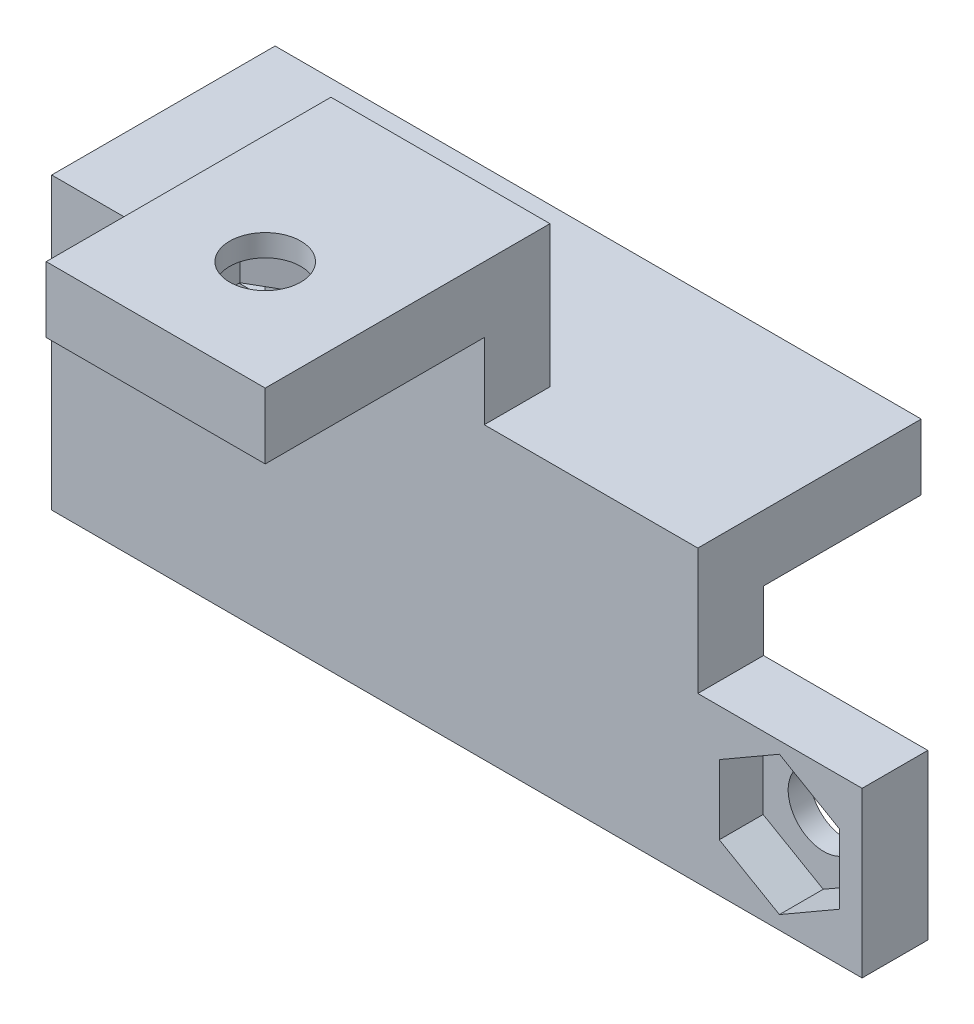
ISO-10303-21;
HEADER;
FILE_DESCRIPTION(('STEP AP214'),'2;1');
FILE_NAME('part.step','',(''),(''),'','','');
FILE_SCHEMA(('AUTOMOTIVE_DESIGN { 1 0 10303 214 1 1 1 1 }'));
ENDSEC;
DATA;
#1=APPLICATION_CONTEXT('core data for automotive mechanical design processes');
#2=APPLICATION_PROTOCOL_DEFINITION('international standard','automotive_design',2000,#1);
#3=PRODUCT_CONTEXT('',#1,'mechanical');
#4=PRODUCT('Part','Part','',(#3));
#5=PRODUCT_RELATED_PRODUCT_CATEGORY('part','',(#4));
#6=PRODUCT_DEFINITION_FORMATION('','',#4);
#7=PRODUCT_DEFINITION_CONTEXT('part definition',#1,'design');
#8=PRODUCT_DEFINITION('design','',#6,#7);
#9=PRODUCT_DEFINITION_SHAPE('','',#8);
#10=(LENGTH_UNIT() NAMED_UNIT(*) SI_UNIT(.MILLI.,.METRE.));
#11=(NAMED_UNIT(*) PLANE_ANGLE_UNIT() SI_UNIT($,.RADIAN.));
#12=(NAMED_UNIT(*) SI_UNIT($,.STERADIAN.) SOLID_ANGLE_UNIT());
#13=UNCERTAINTY_MEASURE_WITH_UNIT(LENGTH_MEASURE(1.E-05),#10,'distance_accuracy_value','');
#14=(GEOMETRIC_REPRESENTATION_CONTEXT(3) GLOBAL_UNCERTAINTY_ASSIGNED_CONTEXT((#13)) GLOBAL_UNIT_ASSIGNED_CONTEXT((#10,
#11,#12)) REPRESENTATION_CONTEXT('',''));
#15=CARTESIAN_POINT('',(0.,0.,0.));
#16=DIRECTION('',(0.,0.,1.));
#17=DIRECTION('',(1.,0.,0.));
#18=AXIS2_PLACEMENT_3D('',#15,#16,#17);
#19=CARTESIAN_POINT('',(-62.7088413646962,-5.00000000000036,8.));
#20=DIRECTION('',(0.,-1.,0.));
#21=DIRECTION('',(0.,0.,-1.));
#22=AXIS2_PLACEMENT_3D('',#19,#20,#21);
#23=CYLINDRICAL_SURFACE('',#22,1.625);
#24=CARTESIAN_POINT('',(-62.7088413646962,-5.00000000000036,8.));
#25=DIRECTION('',(0.,-1.,0.));
#26=DIRECTION('',(0.,0.,-1.));
#27=AXIS2_PLACEMENT_3D('',#24,#25,#26);
#28=CIRCLE('',#27,1.625);
#29=CARTESIAN_POINT('',(-62.7088413646962,-5.00000000000036,6.375));
#30=VERTEX_POINT('',#29);
#31=EDGE_CURVE('E475',#30,#30,#28,.T.);
#32=ORIENTED_EDGE('',*,*,#31,.F.);
#33=EDGE_LOOP('',(#32));
#34=FACE_BOUND('',#33,.T.);
#35=CARTESIAN_POINT('',(-62.7088413646962,-6.00000000000036,8.));
#36=DIRECTION('',(0.,-1.,0.));
#37=DIRECTION('',(0.,0.,-1.));
#38=AXIS2_PLACEMENT_3D('',#35,#36,#37);
#39=CIRCLE('',#38,1.625);
#40=CARTESIAN_POINT('',(-62.7088413646962,-6.00000000000036,6.375));
#41=VERTEX_POINT('',#40);
#42=EDGE_CURVE('E36',#41,#41,#39,.F.);
#43=ORIENTED_EDGE('',*,*,#42,.F.);
#44=EDGE_LOOP('',(#43));
#45=FACE_BOUND('',#44,.T.);
#46=ADVANCED_FACE('F32',(#34,#45),#23,.F.);
#47=CARTESIAN_POINT('',(0.,0.,3.));
#48=DIRECTION('',(0.,0.,1.));
#49=DIRECTION('',(1.,0.,0.));
#50=AXIS2_PLACEMENT_3D('',#47,#48,#49);
#51=PLANE('',#50);
#52=DIRECTION('',(1.,0.,0.));
#53=VECTOR('',#52,1.);
#54=CARTESIAN_POINT('',(-57.7088413646962,-8.00000000000036,3.));
#55=LINE('',#54,#53);
#56=CARTESIAN_POINT('',(-67.7088413646962,-8.00000000000036,3.));
#57=VERTEX_POINT('',#56);
#58=CARTESIAN_POINT('',(-57.7088413646962,-8.00000000000036,3.));
#59=VERTEX_POINT('',#58);
#60=EDGE_CURVE('E57',#57,#59,#55,.T.);
#61=ORIENTED_EDGE('',*,*,#60,.F.);
#62=DIRECTION('',(0.,-1.,0.));
#63=VECTOR('',#62,1.);
#64=CARTESIAN_POINT('',(-67.7088413646962,-5.00000000000036,3.));
#65=LINE('',#64,#63);
#66=CARTESIAN_POINT('',(-67.7088413646962,-11.4500000000005,3.));
#67=VERTEX_POINT('',#66);
#68=EDGE_CURVE('E244',#57,#67,#65,.T.);
#69=ORIENTED_EDGE('',*,*,#68,.T.);
#70=DIRECTION('',(1.,0.,0.));
#71=VECTOR('',#70,1.);
#72=CARTESIAN_POINT('',(-47.958841364696,-11.4500000000003,3.));
#73=LINE('',#72,#71);
#74=CARTESIAN_POINT('',(-77.4588413646964,-11.4500000000005,3.));
#75=VERTEX_POINT('',#74);
#76=EDGE_CURVE('E254',#75,#67,#73,.T.);
#77=ORIENTED_EDGE('',*,*,#76,.F.);
#78=DIRECTION('',(0.,-1.,0.));
#79=VECTOR('',#78,1.);
#80=CARTESIAN_POINT('',(-77.4588413646959,-24.7000000000005,3.));
#81=LINE('',#80,#79);
#82=CARTESIAN_POINT('',(-77.4588413646959,-24.7000000000005,3.));
#83=VERTEX_POINT('',#82);
#84=EDGE_CURVE('E334',#75,#83,#81,.T.);
#85=ORIENTED_EDGE('',*,*,#84,.T.);
#86=DIRECTION('',(1.,0.,0.));
#87=VECTOR('',#86,1.);
#88=CARTESIAN_POINT('',(-40.4588413646959,-24.7000000000014,3.));
#89=LINE('',#88,#87);
#90=CARTESIAN_POINT('',(-40.4588413646959,-24.7000000000014,3.));
#91=VERTEX_POINT('',#90);
#92=EDGE_CURVE('E336',#83,#91,#89,.T.);
#93=ORIENTED_EDGE('',*,*,#92,.T.);
#94=DIRECTION('',(0.,1.,0.));
#95=VECTOR('',#94,1.);
#96=CARTESIAN_POINT('',(-40.4588413646959,-24.7000000000014,3.));
#97=LINE('',#96,#95);
#98=CARTESIAN_POINT('',(-40.4588413646959,-17.2000000000014,3.));
#99=VERTEX_POINT('',#98);
#100=EDGE_CURVE('E325',#91,#99,#97,.T.);
#101=ORIENTED_EDGE('',*,*,#100,.T.);
#102=DIRECTION('',(-1.,0.,0.));
#103=VECTOR('',#102,1.);
#104=CARTESIAN_POINT('',(-40.4588413646959,-17.2000000000014,3.));
#105=LINE('',#104,#103);
#106=CARTESIAN_POINT('',(-47.958841364696,-17.2000000000014,3.));
#107=VERTEX_POINT('',#106);
#108=EDGE_CURVE('E328',#99,#107,#105,.T.);
#109=ORIENTED_EDGE('',*,*,#108,.T.);
#110=DIRECTION('',(0.,1.,0.));
#111=VECTOR('',#110,1.);
#112=CARTESIAN_POINT('',(-47.958841364696,-17.2000000000014,3.));
#113=LINE('',#112,#111);
#114=CARTESIAN_POINT('',(-47.958841364696,-11.4500000000003,3.));
#115=VERTEX_POINT('',#114);
#116=EDGE_CURVE('E331',#107,#115,#113,.T.);
#117=ORIENTED_EDGE('',*,*,#116,.T.);
#118=CARTESIAN_POINT('',(-57.7088413646962,-11.4500000000004,3.));
#119=VERTEX_POINT('',#118);
#120=EDGE_CURVE('E252',#119,#115,#73,.T.);
#121=ORIENTED_EDGE('',*,*,#120,.F.);
#122=DIRECTION('',(0.,1.,0.));
#123=VECTOR('',#122,1.);
#124=CARTESIAN_POINT('',(-57.7088413646962,-11.4500000000005,3.));
#125=LINE('',#124,#123);
#126=EDGE_CURVE('E242',#119,#59,#125,.T.);
#127=ORIENTED_EDGE('',*,*,#126,.T.);
#128=EDGE_LOOP('',(#61,#69,#77,#85,#93,#101,#109,#117,#121,#127));
#129=FACE_BOUND('',#128,.T.);
#130=DIRECTION('',(-0.866025403784438,0.500000000000001,0.));
#131=VECTOR('',#130,1.);
#132=CARTESIAN_POINT('',(-41.4871923916485,-19.3240343016862,3.));
#133=LINE('',#132,#131);
#134=CARTESIAN_POINT('',(-41.4871923916485,-19.3240343016862,3.));
#135=VERTEX_POINT('',#134);
#136=CARTESIAN_POINT('',(-44.2324929216451,-17.7390343016861,3.));
#137=VERTEX_POINT('',#136);
#138=EDGE_CURVE('E272',#135,#137,#133,.T.);
#139=ORIENTED_EDGE('',*,*,#138,.F.);
#140=DIRECTION('',(0.,1.,0.));
#141=VECTOR('',#140,1.);
#142=CARTESIAN_POINT('',(-41.4871923916485,-22.4940343016861,3.));
#143=LINE('',#142,#141);
#144=CARTESIAN_POINT('',(-41.4871923916485,-22.4940343016861,3.));
#145=VERTEX_POINT('',#144);
#146=EDGE_CURVE('E277',#145,#135,#143,.T.);
#147=ORIENTED_EDGE('',*,*,#146,.F.);
#148=DIRECTION('',(0.866025403784439,0.5,0.));
#149=VECTOR('',#148,1.);
#150=CARTESIAN_POINT('',(-44.2324929216451,-24.0790343016861,3.));
#151=LINE('',#150,#149);
#152=CARTESIAN_POINT('',(-44.2324929216451,-24.0790343016861,3.));
#153=VERTEX_POINT('',#152);
#154=EDGE_CURVE('E303',#153,#145,#151,.T.);
#155=ORIENTED_EDGE('',*,*,#154,.F.);
#156=DIRECTION('',(0.866025403784439,-0.5,0.));
#157=VECTOR('',#156,1.);
#158=CARTESIAN_POINT('',(-46.9777934516418,-22.4940343016861,3.));
#159=LINE('',#158,#157);
#160=CARTESIAN_POINT('',(-46.9777934516418,-22.4940343016861,3.));
#161=VERTEX_POINT('',#160);
#162=EDGE_CURVE('E300',#161,#153,#159,.T.);
#163=ORIENTED_EDGE('',*,*,#162,.F.);
#164=DIRECTION('',(0.,-1.,0.));
#165=VECTOR('',#164,1.);
#166=CARTESIAN_POINT('',(-46.9777934516418,-19.3240343016861,3.));
#167=LINE('',#166,#165);
#168=CARTESIAN_POINT('',(-46.9777934516418,-19.3240343016861,3.));
#169=VERTEX_POINT('',#168);
#170=EDGE_CURVE('E297',#169,#161,#167,.T.);
#171=ORIENTED_EDGE('',*,*,#170,.F.);
#172=DIRECTION('',(-0.86602540378444,-0.499999999999998,0.));
#173=VECTOR('',#172,1.);
#174=CARTESIAN_POINT('',(-44.2324929216451,-17.7390343016862,3.));
#175=LINE('',#174,#173);
#176=EDGE_CURVE('E294',#137,#169,#175,.T.);
#177=ORIENTED_EDGE('',*,*,#176,.F.);
#178=EDGE_LOOP('',(#139,#147,#155,#163,#171,#177));
#179=FACE_BOUND('',#178,.T.);
#180=ADVANCED_FACE('F392',(#129,#179),#51,.T.);
#181=CARTESIAN_POINT('',(-44.2088413646959,-20.9500000000014,3.));
#182=DIRECTION('',(0.,0.,-1.));
#183=DIRECTION('',(-1.,0.,0.));
#184=AXIS2_PLACEMENT_3D('',#181,#182,#183);
#185=CYLINDRICAL_SURFACE('',#184,1.62500000000032);
#186=CARTESIAN_POINT('',(-44.2088413646959,-20.9500000000014,0.));
#187=DIRECTION('',(0.,0.,1.));
#188=DIRECTION('',(1.,0.,0.));
#189=AXIS2_PLACEMENT_3D('',#186,#187,#188);
#190=CIRCLE('',#189,1.62500000000032);
#191=CARTESIAN_POINT('',(-42.5838413646956,-20.9500000000014,0.));
#192=VERTEX_POINT('',#191);
#193=EDGE_CURVE('E321',#192,#192,#190,.T.);
#194=ORIENTED_EDGE('',*,*,#193,.F.);
#195=EDGE_LOOP('',(#194));
#196=FACE_BOUND('',#195,.T.);
#197=CARTESIAN_POINT('',(-44.2088413646959,-20.9500000000014,1.));
#198=DIRECTION('',(0.,0.,1.));
#199=DIRECTION('',(1.,0.,0.));
#200=AXIS2_PLACEMENT_3D('',#197,#198,#199);
#201=CIRCLE('',#200,1.62500000000032);
#202=CARTESIAN_POINT('',(-42.5838413646956,-20.9500000000014,1.));
#203=VERTEX_POINT('',#202);
#204=EDGE_CURVE('E310',#203,#203,#201,.T.);
#205=ORIENTED_EDGE('',*,*,#204,.T.);
#206=EDGE_LOOP('',(#205));
#207=FACE_BOUND('',#206,.T.);
#208=ADVANCED_FACE('F360',(#196,#207),#185,.F.);
#209=CARTESIAN_POINT('',(0.,0.,0.));
#210=DIRECTION('',(0.,0.,1.));
#211=DIRECTION('',(1.,0.,0.));
#212=AXIS2_PLACEMENT_3D('',#209,#210,#211);
#213=PLANE('',#212);
#214=DIRECTION('',(0.,1.,0.));
#215=VECTOR('',#214,1.);
#216=CARTESIAN_POINT('',(-40.4588413646959,-24.7000000000014,0.));
#217=LINE('',#216,#215);
#218=CARTESIAN_POINT('',(-40.4588413646959,-24.7000000000014,0.));
#219=VERTEX_POINT('',#218);
#220=CARTESIAN_POINT('',(-40.4588413646959,-17.2000000000014,0.));
#221=VERTEX_POINT('',#220);
#222=EDGE_CURVE('E324',#219,#221,#217,.T.);
#223=ORIENTED_EDGE('',*,*,#222,.F.);
#224=DIRECTION('',(1.,0.,0.));
#225=VECTOR('',#224,1.);
#226=CARTESIAN_POINT('',(-40.4588413646959,-24.7000000000014,0.));
#227=LINE('',#226,#225);
#228=CARTESIAN_POINT('',(-77.4588413646959,-24.7000000000005,0.));
#229=VERTEX_POINT('',#228);
#230=EDGE_CURVE('E329',#229,#219,#227,.T.);
#231=ORIENTED_EDGE('',*,*,#230,.F.);
#232=DIRECTION('',(0.,-1.,0.));
#233=VECTOR('',#232,1.);
#234=CARTESIAN_POINT('',(-77.4588413646959,-24.7000000000005,0.));
#235=LINE('',#234,#233);
#236=CARTESIAN_POINT('',(-77.4588413646964,-14.4500000000005,0.));
#237=VERTEX_POINT('',#236);
#238=EDGE_CURVE('E348',#237,#229,#235,.T.);
#239=ORIENTED_EDGE('',*,*,#238,.F.);
#240=DIRECTION('',(-1.,0.,0.));
#241=VECTOR('',#240,1.);
#242=CARTESIAN_POINT('',(-77.458841364696,-14.4500000000005,0.));
#243=LINE('',#242,#241);
#244=CARTESIAN_POINT('',(-47.958841364696,-14.4500000000003,0.));
#245=VERTEX_POINT('',#244);
#246=EDGE_CURVE('E345',#245,#237,#243,.T.);
#247=ORIENTED_EDGE('',*,*,#246,.F.);
#248=DIRECTION('',(0.,1.,0.));
#249=VECTOR('',#248,1.);
#250=CARTESIAN_POINT('',(-47.958841364696,-17.2000000000014,0.));
#251=LINE('',#250,#249);
#252=CARTESIAN_POINT('',(-47.958841364696,-17.2000000000014,0.));
#253=VERTEX_POINT('',#252);
#254=EDGE_CURVE('E343',#253,#245,#251,.T.);
#255=ORIENTED_EDGE('',*,*,#254,.F.);
#256=DIRECTION('',(-1.,0.,0.));
#257=VECTOR('',#256,1.);
#258=CARTESIAN_POINT('',(-40.4588413646959,-17.2000000000014,0.));
#259=LINE('',#258,#257);
#260=EDGE_CURVE('E341',#221,#253,#259,.T.);
#261=ORIENTED_EDGE('',*,*,#260,.F.);
#262=EDGE_LOOP('',(#223,#231,#239,#247,#255,#261));
#263=FACE_BOUND('',#262,.T.);
#264=ORIENTED_EDGE('',*,*,#193,.T.);
#265=EDGE_LOOP('',(#264));
#266=FACE_BOUND('',#265,.T.);
#267=ADVANCED_FACE('F399',(#263,#266),#213,.F.);
#268=CARTESIAN_POINT('',(-40.4588413646959,-24.7000000000014,3.));
#269=DIRECTION('',(-1.,0.,0.));
#270=DIRECTION('',(0.,0.,1.));
#271=AXIS2_PLACEMENT_3D('',#268,#269,#270);
#272=PLANE('',#271);
#273=ORIENTED_EDGE('',*,*,#222,.T.);
#274=DIRECTION('',(0.,0.,-1.));
#275=VECTOR('',#274,1.);
#276=CARTESIAN_POINT('',(-40.4588413646959,-17.2000000000014,3.));
#277=LINE('',#276,#275);
#278=EDGE_CURVE('E11',#99,#221,#277,.T.);
#279=ORIENTED_EDGE('',*,*,#278,.F.);
#280=ORIENTED_EDGE('',*,*,#100,.F.);
#281=DIRECTION('',(0.,0.,-1.));
#282=VECTOR('',#281,1.);
#283=CARTESIAN_POINT('',(-40.4588413646959,-24.7000000000014,3.));
#284=LINE('',#283,#282);
#285=EDGE_CURVE('E338',#91,#219,#284,.T.);
#286=ORIENTED_EDGE('',*,*,#285,.T.);
#287=EDGE_LOOP('',(#273,#279,#280,#286));
#288=FACE_BOUND('',#287,.T.);
#289=ADVANCED_FACE('F34',(#288),#272,.F.);
#290=CARTESIAN_POINT('',(-40.4588413646959,-17.2000000000014,3.));
#291=DIRECTION('',(0.,-1.,0.));
#292=DIRECTION('',(0.,0.,-1.));
#293=AXIS2_PLACEMENT_3D('',#290,#291,#292);
#294=PLANE('',#293);
#295=ORIENTED_EDGE('',*,*,#260,.T.);
#296=DIRECTION('',(0.,0.,-1.));
#297=VECTOR('',#296,1.);
#298=CARTESIAN_POINT('',(-47.958841364696,-17.2000000000014,3.));
#299=LINE('',#298,#297);
#300=EDGE_CURVE('E41',#107,#253,#299,.T.);
#301=ORIENTED_EDGE('',*,*,#300,.F.);
#302=ORIENTED_EDGE('',*,*,#108,.F.);
#303=ORIENTED_EDGE('',*,*,#278,.T.);
#304=EDGE_LOOP('',(#295,#301,#302,#303));
#305=FACE_BOUND('',#304,.T.);
#306=ADVANCED_FACE('F419',(#305),#294,.F.);
#307=CARTESIAN_POINT('',(-47.958841364696,-17.2000000000014,3.));
#308=DIRECTION('',(-1.,0.,0.));
#309=DIRECTION('',(0.,0.,1.));
#310=AXIS2_PLACEMENT_3D('',#307,#308,#309);
#311=PLANE('',#310);
#312=ORIENTED_EDGE('',*,*,#254,.T.);
#313=DIRECTION('',(0.,0.,-1.));
#314=VECTOR('',#313,1.);
#315=CARTESIAN_POINT('',(-47.958841364696,-14.4500000000003,3.));
#316=LINE('',#315,#314);
#317=CARTESIAN_POINT('',(-47.958841364696,-14.4500000000003,-7.2));
#318=VERTEX_POINT('',#317);
#319=EDGE_CURVE('E264',#245,#318,#316,.T.);
#320=ORIENTED_EDGE('',*,*,#319,.T.);
#321=DIRECTION('',(0.,-1.,0.));
#322=VECTOR('',#321,1.);
#323=CARTESIAN_POINT('',(-47.958841364696,-11.4500000000003,-7.2));
#324=LINE('',#323,#322);
#325=CARTESIAN_POINT('',(-47.958841364696,-11.4500000000003,-7.2));
#326=VERTEX_POINT('',#325);
#327=EDGE_CURVE('E269',#326,#318,#324,.T.);
#328=ORIENTED_EDGE('',*,*,#327,.F.);
#329=DIRECTION('',(0.,0.,-1.));
#330=VECTOR('',#329,1.);
#331=CARTESIAN_POINT('',(-47.958841364696,-11.4500000000003,3.));
#332=LINE('',#331,#330);
#333=EDGE_CURVE('E257',#115,#326,#332,.T.);
#334=ORIENTED_EDGE('',*,*,#333,.F.);
#335=ORIENTED_EDGE('',*,*,#116,.F.);
#336=ORIENTED_EDGE('',*,*,#300,.T.);
#337=EDGE_LOOP('',(#312,#320,#328,#334,#335,#336));
#338=FACE_BOUND('',#337,.T.);
#339=ADVANCED_FACE('F416',(#338),#311,.F.);
#340=CARTESIAN_POINT('',(-77.4588413646959,-24.7000000000005,3.));
#341=DIRECTION('',(1.,0.,0.));
#342=DIRECTION('',(0.,1.,0.));
#343=AXIS2_PLACEMENT_3D('',#340,#341,#342);
#344=PLANE('',#343);
#345=ORIENTED_EDGE('',*,*,#238,.T.);
#346=DIRECTION('',(0.,0.,-1.));
#347=VECTOR('',#346,1.);
#348=CARTESIAN_POINT('',(-77.4588413646959,-24.7000000000005,3.));
#349=LINE('',#348,#347);
#350=EDGE_CURVE('E353',#83,#229,#349,.T.);
#351=ORIENTED_EDGE('',*,*,#350,.F.);
#352=ORIENTED_EDGE('',*,*,#84,.F.);
#353=DIRECTION('',(0.,0.,1.));
#354=VECTOR('',#353,1.);
#355=CARTESIAN_POINT('',(-77.4588413646964,-11.4500000000005,3.));
#356=LINE('',#355,#354);
#357=CARTESIAN_POINT('',(-77.4588413646964,-11.4500000000005,-7.2));
#358=VERTEX_POINT('',#357);
#359=EDGE_CURVE('E249',#358,#75,#356,.T.);
#360=ORIENTED_EDGE('',*,*,#359,.F.);
#361=DIRECTION('',(0.,-1.,0.));
#362=VECTOR('',#361,1.);
#363=CARTESIAN_POINT('',(-77.4588413646964,-11.4500000000005,-7.2));
#364=LINE('',#363,#362);
#365=CARTESIAN_POINT('',(-77.4588413646964,-14.4500000000005,-7.2));
#366=VERTEX_POINT('',#365);
#367=EDGE_CURVE('E261',#358,#366,#364,.T.);
#368=ORIENTED_EDGE('',*,*,#367,.T.);
#369=DIRECTION('',(0.,0.,1.));
#370=VECTOR('',#369,1.);
#371=CARTESIAN_POINT('',(-77.4588413646964,-14.4500000000005,3.));
#372=LINE('',#371,#370);
#373=EDGE_CURVE('E247',#366,#237,#372,.T.);
#374=ORIENTED_EDGE('',*,*,#373,.T.);
#375=EDGE_LOOP('',(#345,#351,#352,#360,#368,#374));
#376=FACE_BOUND('',#375,.T.);
#377=ADVANCED_FACE('F412',(#376),#344,.F.);
#378=CARTESIAN_POINT('',(-40.4588413646959,-24.7000000000014,3.));
#379=DIRECTION('',(0.,1.,0.));
#380=DIRECTION('',(-1.,0.,0.));
#381=AXIS2_PLACEMENT_3D('',#378,#379,#380);
#382=PLANE('',#381);
#383=ORIENTED_EDGE('',*,*,#230,.T.);
#384=ORIENTED_EDGE('',*,*,#285,.F.);
#385=ORIENTED_EDGE('',*,*,#92,.F.);
#386=ORIENTED_EDGE('',*,*,#350,.T.);
#387=EDGE_LOOP('',(#383,#384,#385,#386));
#388=FACE_BOUND('',#387,.T.);
#389=ADVANCED_FACE('F409',(#388),#382,.F.);
#390=CARTESIAN_POINT('',(-41.4871923916485,-19.3240343016862,1.));
#391=DIRECTION('',(0.500000000000001,0.866025403784438,0.));
#392=DIRECTION('',(-0.866025403784438,0.500000000000001,0.));
#393=AXIS2_PLACEMENT_3D('',#390,#391,#392);
#394=PLANE('',#393);
#395=ORIENTED_EDGE('',*,*,#138,.T.);
#396=DIRECTION('',(0.,0.,1.));
#397=VECTOR('',#396,1.);
#398=CARTESIAN_POINT('',(-44.2324929216451,-17.7390343016862,1.));
#399=LINE('',#398,#397);
#400=CARTESIAN_POINT('',(-44.2324929216451,-17.7390343016862,1.));
#401=VERTEX_POINT('',#400);
#402=EDGE_CURVE('E292',#401,#137,#399,.T.);
#403=ORIENTED_EDGE('',*,*,#402,.F.);
#404=DIRECTION('',(-0.866025403784438,0.500000000000001,0.));
#405=VECTOR('',#404,1.);
#406=CARTESIAN_POINT('',(-41.4871923916485,-19.3240343016862,1.));
#407=LINE('',#406,#405);
#408=CARTESIAN_POINT('',(-41.4871923916485,-19.3240343016862,1.));
#409=VERTEX_POINT('',#408);
#410=EDGE_CURVE('E273',#409,#401,#407,.T.);
#411=ORIENTED_EDGE('',*,*,#410,.F.);
#412=DIRECTION('',(0.,0.,1.));
#413=VECTOR('',#412,1.);
#414=CARTESIAN_POINT('',(-41.4871923916485,-19.3240343016862,1.));
#415=LINE('',#414,#413);
#416=EDGE_CURVE('E308',#409,#135,#415,.T.);
#417=ORIENTED_EDGE('',*,*,#416,.T.);
#418=EDGE_LOOP('',(#395,#403,#411,#417));
#419=FACE_BOUND('',#418,.T.);
#420=ADVANCED_FACE('F372',(#419),#394,.F.);
#421=CARTESIAN_POINT('',(-41.4871923916485,-22.4940343016861,1.));
#422=DIRECTION('',(1.,0.,0.));
#423=DIRECTION('',(0.,0.,-1.));
#424=AXIS2_PLACEMENT_3D('',#421,#422,#423);
#425=PLANE('',#424);
#426=ORIENTED_EDGE('',*,*,#146,.T.);
#427=ORIENTED_EDGE('',*,*,#416,.F.);
#428=DIRECTION('',(0.,1.,0.));
#429=VECTOR('',#428,1.);
#430=CARTESIAN_POINT('',(-41.4871923916485,-22.4940343016861,1.));
#431=LINE('',#430,#429);
#432=CARTESIAN_POINT('',(-41.4871923916485,-22.4940343016861,1.));
#433=VERTEX_POINT('',#432);
#434=EDGE_CURVE('E289',#433,#409,#431,.T.);
#435=ORIENTED_EDGE('',*,*,#434,.F.);
#436=DIRECTION('',(0.,0.,1.));
#437=VECTOR('',#436,1.);
#438=CARTESIAN_POINT('',(-41.4871923916485,-22.4940343016861,1.));
#439=LINE('',#438,#437);
#440=EDGE_CURVE('E311',#433,#145,#439,.T.);
#441=ORIENTED_EDGE('',*,*,#440,.T.);
#442=EDGE_LOOP('',(#426,#427,#435,#441));
#443=FACE_BOUND('',#442,.T.);
#444=ADVANCED_FACE('F390',(#443),#425,.F.);
#445=CARTESIAN_POINT('',(-44.2324929216451,-24.0790343016861,1.));
#446=DIRECTION('',(0.5,-0.866025403784439,0.));
#447=DIRECTION('',(0.866025403784439,0.5,0.));
#448=AXIS2_PLACEMENT_3D('',#445,#446,#447);
#449=PLANE('',#448);
#450=ORIENTED_EDGE('',*,*,#154,.T.);
#451=ORIENTED_EDGE('',*,*,#440,.F.);
#452=DIRECTION('',(0.866025403784439,0.5,0.));
#453=VECTOR('',#452,1.);
#454=CARTESIAN_POINT('',(-44.2324929216451,-24.0790343016861,1.));
#455=LINE('',#454,#453);
#456=CARTESIAN_POINT('',(-44.2324929216451,-24.0790343016861,1.));
#457=VERTEX_POINT('',#456);
#458=EDGE_CURVE('E286',#457,#433,#455,.T.);
#459=ORIENTED_EDGE('',*,*,#458,.F.);
#460=DIRECTION('',(0.,0.,1.));
#461=VECTOR('',#460,1.);
#462=CARTESIAN_POINT('',(-44.2324929216451,-24.0790343016861,1.));
#463=LINE('',#462,#461);
#464=EDGE_CURVE('E313',#457,#153,#463,.T.);
#465=ORIENTED_EDGE('',*,*,#464,.T.);
#466=EDGE_LOOP('',(#450,#451,#459,#465));
#467=FACE_BOUND('',#466,.T.);
#468=ADVANCED_FACE('F387',(#467),#449,.F.);
#469=CARTESIAN_POINT('',(-46.9777934516418,-22.4940343016861,1.));
#470=DIRECTION('',(-0.5,-0.866025403784439,0.));
#471=DIRECTION('',(0.866025403784439,-0.5,0.));
#472=AXIS2_PLACEMENT_3D('',#469,#470,#471);
#473=PLANE('',#472);
#474=ORIENTED_EDGE('',*,*,#162,.T.);
#475=ORIENTED_EDGE('',*,*,#464,.F.);
#476=DIRECTION('',(0.866025403784439,-0.5,0.));
#477=VECTOR('',#476,1.);
#478=CARTESIAN_POINT('',(-46.9777934516418,-22.4940343016861,1.));
#479=LINE('',#478,#477);
#480=CARTESIAN_POINT('',(-46.9777934516418,-22.4940343016861,1.));
#481=VERTEX_POINT('',#480);
#482=EDGE_CURVE('E283',#481,#457,#479,.T.);
#483=ORIENTED_EDGE('',*,*,#482,.F.);
#484=DIRECTION('',(0.,0.,1.));
#485=VECTOR('',#484,1.);
#486=CARTESIAN_POINT('',(-46.9777934516418,-22.4940343016861,1.));
#487=LINE('',#486,#485);
#488=EDGE_CURVE('E315',#481,#161,#487,.T.);
#489=ORIENTED_EDGE('',*,*,#488,.T.);
#490=EDGE_LOOP('',(#474,#475,#483,#489));
#491=FACE_BOUND('',#490,.T.);
#492=ADVANCED_FACE('F383',(#491),#473,.F.);
#493=CARTESIAN_POINT('',(-46.9777934516418,-19.3240343016861,1.));
#494=DIRECTION('',(-1.,0.,0.));
#495=DIRECTION('',(0.,0.,1.));
#496=AXIS2_PLACEMENT_3D('',#493,#494,#495);
#497=PLANE('',#496);
#498=ORIENTED_EDGE('',*,*,#170,.T.);
#499=ORIENTED_EDGE('',*,*,#488,.F.);
#500=DIRECTION('',(0.,-1.,0.));
#501=VECTOR('',#500,1.);
#502=CARTESIAN_POINT('',(-46.9777934516418,-19.3240343016861,1.));
#503=LINE('',#502,#501);
#504=CARTESIAN_POINT('',(-46.9777934516418,-19.3240343016861,1.));
#505=VERTEX_POINT('',#504);
#506=EDGE_CURVE('E280',#505,#481,#503,.T.);
#507=ORIENTED_EDGE('',*,*,#506,.F.);
#508=DIRECTION('',(0.,0.,1.));
#509=VECTOR('',#508,1.);
#510=CARTESIAN_POINT('',(-46.9777934516418,-19.3240343016861,1.));
#511=LINE('',#510,#509);
#512=EDGE_CURVE('E317',#505,#169,#511,.T.);
#513=ORIENTED_EDGE('',*,*,#512,.T.);
#514=EDGE_LOOP('',(#498,#499,#507,#513));
#515=FACE_BOUND('',#514,.T.);
#516=ADVANCED_FACE('F379',(#515),#497,.F.);
#517=CARTESIAN_POINT('',(-44.2324929216451,-17.7390343016862,1.));
#518=DIRECTION('',(-0.499999999999998,0.86602540378444,0.));
#519=DIRECTION('',(-0.86602540378444,-0.499999999999998,0.));
#520=AXIS2_PLACEMENT_3D('',#517,#518,#519);
#521=PLANE('',#520);
#522=ORIENTED_EDGE('',*,*,#176,.T.);
#523=ORIENTED_EDGE('',*,*,#512,.F.);
#524=DIRECTION('',(-0.86602540378444,-0.499999999999998,0.));
#525=VECTOR('',#524,1.);
#526=CARTESIAN_POINT('',(-44.2324929216451,-17.7390343016862,1.));
#527=LINE('',#526,#525);
#528=EDGE_CURVE('E276',#401,#505,#527,.T.);
#529=ORIENTED_EDGE('',*,*,#528,.F.);
#530=ORIENTED_EDGE('',*,*,#402,.T.);
#531=EDGE_LOOP('',(#522,#523,#529,#530));
#532=FACE_BOUND('',#531,.T.);
#533=ADVANCED_FACE('F366',(#532),#521,.F.);
#534=CARTESIAN_POINT('',(0.,0.,1.));
#535=DIRECTION('',(0.,0.,1.));
#536=DIRECTION('',(1.,0.,0.));
#537=AXIS2_PLACEMENT_3D('',#534,#535,#536);
#538=PLANE('',#537);
#539=ORIENTED_EDGE('',*,*,#204,.F.);
#540=EDGE_LOOP('',(#539));
#541=FACE_BOUND('',#540,.T.);
#542=ORIENTED_EDGE('',*,*,#410,.T.);
#543=ORIENTED_EDGE('',*,*,#528,.T.);
#544=ORIENTED_EDGE('',*,*,#506,.T.);
#545=ORIENTED_EDGE('',*,*,#482,.T.);
#546=ORIENTED_EDGE('',*,*,#458,.T.);
#547=ORIENTED_EDGE('',*,*,#434,.T.);
#548=EDGE_LOOP('',(#542,#543,#544,#545,#546,#547));
#549=FACE_BOUND('',#548,.T.);
#550=ADVANCED_FACE('F362',(#541,#549),#538,.T.);
#551=CARTESIAN_POINT('',(1.00267016911458E-13,-14.45,0.));
#552=DIRECTION('',(0.,1.,0.));
#553=DIRECTION('',(-1.,0.,0.));
#554=AXIS2_PLACEMENT_3D('',#551,#552,#553);
#555=PLANE('',#554);
#556=ORIENTED_EDGE('',*,*,#319,.F.);
#557=ORIENTED_EDGE('',*,*,#246,.T.);
#558=ORIENTED_EDGE('',*,*,#373,.F.);
#559=DIRECTION('',(-1.,0.,0.));
#560=VECTOR('',#559,1.);
#561=CARTESIAN_POINT('',(-47.958841364696,-14.4500000000003,-7.2));
#562=LINE('',#561,#560);
#563=EDGE_CURVE('E253',#318,#366,#562,.T.);
#564=ORIENTED_EDGE('',*,*,#563,.F.);
#565=EDGE_LOOP('',(#556,#557,#558,#564));
#566=FACE_BOUND('',#565,.T.);
#567=ADVANCED_FACE('F365',(#566),#555,.F.);
#568=CARTESIAN_POINT('',(-47.958841364696,-11.4500000000003,-7.2));
#569=DIRECTION('',(0.,0.,1.));
#570=DIRECTION('',(1.,0.,0.));
#571=AXIS2_PLACEMENT_3D('',#568,#569,#570);
#572=PLANE('',#571);
#573=ORIENTED_EDGE('',*,*,#563,.T.);
#574=ORIENTED_EDGE('',*,*,#367,.F.);
#575=DIRECTION('',(-1.,0.,0.));
#576=VECTOR('',#575,1.);
#577=CARTESIAN_POINT('',(-47.958841364696,-11.4500000000003,-7.2));
#578=LINE('',#577,#576);
#579=EDGE_CURVE('E259',#326,#358,#578,.T.);
#580=ORIENTED_EDGE('',*,*,#579,.F.);
#581=ORIENTED_EDGE('',*,*,#327,.T.);
#582=EDGE_LOOP('',(#573,#574,#580,#581));
#583=FACE_BOUND('',#582,.T.);
#584=ADVANCED_FACE('F443',(#583),#572,.F.);
#585=CARTESIAN_POINT('',(0.,-11.45,0.));
#586=DIRECTION('',(0.,1.,0.));
#587=DIRECTION('',(-1.,0.,0.));
#588=AXIS2_PLACEMENT_3D('',#585,#586,#587);
#589=PLANE('',#588);
#590=DIRECTION('',(0.,0.,1.));
#591=VECTOR('',#590,1.);
#592=CARTESIAN_POINT('',(-67.7088413646962,-11.4500000000005,0.));
#593=LINE('',#592,#591);
#594=CARTESIAN_POINT('',(-67.7088413646962,-11.4500000000005,0.));
#595=VERTEX_POINT('',#594);
#596=EDGE_CURVE('E237',#595,#67,#593,.T.);
#597=ORIENTED_EDGE('',*,*,#596,.F.);
#598=DIRECTION('',(1.,0.,0.));
#599=VECTOR('',#598,1.);
#600=CARTESIAN_POINT('',(-62.7088413646962,-11.4500000000004,0.));
#601=LINE('',#600,#599);
#602=CARTESIAN_POINT('',(-57.7088413646962,-11.4500000000005,0.));
#603=VERTEX_POINT('',#602);
#604=EDGE_CURVE('E231',#595,#603,#601,.T.);
#605=ORIENTED_EDGE('',*,*,#604,.T.);
#606=DIRECTION('',(0.,0.,1.));
#607=VECTOR('',#606,1.);
#608=CARTESIAN_POINT('',(-57.7088413646962,-11.4500000000005,0.));
#609=LINE('',#608,#607);
#610=EDGE_CURVE('E233',#603,#119,#609,.T.);
#611=ORIENTED_EDGE('',*,*,#610,.T.);
#612=ORIENTED_EDGE('',*,*,#120,.T.);
#613=ORIENTED_EDGE('',*,*,#333,.T.);
#614=ORIENTED_EDGE('',*,*,#579,.T.);
#615=ORIENTED_EDGE('',*,*,#359,.T.);
#616=ORIENTED_EDGE('',*,*,#76,.T.);
#617=EDGE_LOOP('',(#597,#605,#611,#612,#613,#614,#615,#616));
#618=FACE_BOUND('',#617,.T.);
#619=ADVANCED_FACE('F447',(#618),#589,.T.);
#620=CARTESIAN_POINT('',(-67.7088413646962,-5.00000000000036,0.));
#621=DIRECTION('',(-1.,0.,0.));
#622=DIRECTION('',(0.,0.,1.));
#623=AXIS2_PLACEMENT_3D('',#620,#621,#622);
#624=PLANE('',#623);
#625=DIRECTION('',(0.,0.,-1.));
#626=VECTOR('',#625,1.);
#627=CARTESIAN_POINT('',(-67.7088413646962,-5.00000000000036,13.));
#628=LINE('',#627,#626);
#629=CARTESIAN_POINT('',(-67.7088413646962,-5.00000000000036,13.));
#630=VERTEX_POINT('',#629);
#631=CARTESIAN_POINT('',(-67.7088413646962,-5.00000000000037,0.));
#632=VERTEX_POINT('',#631);
#633=EDGE_CURVE('E207',#630,#632,#628,.T.);
#634=ORIENTED_EDGE('',*,*,#633,.T.);
#635=DIRECTION('',(0.,-1.,0.));
#636=VECTOR('',#635,1.);
#637=CARTESIAN_POINT('',(-67.7088413646962,-5.00000000000036,0.));
#638=LINE('',#637,#636);
#639=EDGE_CURVE('E212',#632,#595,#638,.T.);
#640=ORIENTED_EDGE('',*,*,#639,.T.);
#641=ORIENTED_EDGE('',*,*,#596,.T.);
#642=ORIENTED_EDGE('',*,*,#68,.F.);
#643=DIRECTION('',(0.,0.,-1.));
#644=VECTOR('',#643,1.);
#645=CARTESIAN_POINT('',(-67.7088413646962,-8.00000000000036,13.));
#646=LINE('',#645,#644);
#647=CARTESIAN_POINT('',(-67.7088413646962,-8.00000000000036,13.));
#648=VERTEX_POINT('',#647);
#649=EDGE_CURVE('E219',#648,#57,#646,.T.);
#650=ORIENTED_EDGE('',*,*,#649,.F.);
#651=DIRECTION('',(0.,-1.,0.));
#652=VECTOR('',#651,1.);
#653=CARTESIAN_POINT('',(-67.7088413646962,-8.00000000000036,13.));
#654=LINE('',#653,#652);
#655=EDGE_CURVE('E215',#630,#648,#654,.T.);
#656=ORIENTED_EDGE('',*,*,#655,.F.);
#657=EDGE_LOOP('',(#634,#640,#641,#642,#650,#656));
#658=FACE_BOUND('',#657,.T.);
#659=ADVANCED_FACE('F209',(#658),#624,.T.);
#660=CARTESIAN_POINT('',(-57.7088413646962,-11.4500000000005,0.));
#661=DIRECTION('',(1.,0.,0.));
#662=DIRECTION('',(0.,1.,0.));
#663=AXIS2_PLACEMENT_3D('',#660,#661,#662);
#664=PLANE('',#663);
#665=DIRECTION('',(0.,1.,0.));
#666=VECTOR('',#665,1.);
#667=CARTESIAN_POINT('',(-57.7088413646962,-11.4500000000005,0.));
#668=LINE('',#667,#666);
#669=CARTESIAN_POINT('',(-57.7088413646962,-5.00000000000036,0.));
#670=VERTEX_POINT('',#669);
#671=EDGE_CURVE('E234',#603,#670,#668,.T.);
#672=ORIENTED_EDGE('',*,*,#671,.T.);
#673=DIRECTION('',(0.,0.,-1.));
#674=VECTOR('',#673,1.);
#675=CARTESIAN_POINT('',(-57.7088413646962,-5.00000000000036,13.));
#676=LINE('',#675,#674);
#677=CARTESIAN_POINT('',(-57.7088413646962,-5.00000000000036,13.));
#678=VERTEX_POINT('',#677);
#679=EDGE_CURVE('E218',#678,#670,#676,.T.);
#680=ORIENTED_EDGE('',*,*,#679,.F.);
#681=DIRECTION('',(0.,1.,0.));
#682=VECTOR('',#681,1.);
#683=CARTESIAN_POINT('',(-57.7088413646962,-8.00000000000036,13.));
#684=LINE('',#683,#682);
#685=CARTESIAN_POINT('',(-57.7088413646962,-8.00000000000036,13.));
#686=VERTEX_POINT('',#685);
#687=EDGE_CURVE('E470',#686,#678,#684,.T.);
#688=ORIENTED_EDGE('',*,*,#687,.F.);
#689=DIRECTION('',(0.,0.,-1.));
#690=VECTOR('',#689,1.);
#691=CARTESIAN_POINT('',(-57.7088413646962,-8.00000000000036,13.));
#692=LINE('',#691,#690);
#693=EDGE_CURVE('E245',#686,#59,#692,.T.);
#694=ORIENTED_EDGE('',*,*,#693,.T.);
#695=ORIENTED_EDGE('',*,*,#126,.F.);
#696=ORIENTED_EDGE('',*,*,#610,.F.);
#697=EDGE_LOOP('',(#672,#680,#688,#694,#695,#696));
#698=FACE_BOUND('',#697,.T.);
#699=ADVANCED_FACE('F469',(#698),#664,.T.);
#700=CARTESIAN_POINT('',(0.,0.,0.));
#701=DIRECTION('',(0.,0.,1.));
#702=DIRECTION('',(1.,0.,0.));
#703=AXIS2_PLACEMENT_3D('',#700,#701,#702);
#704=PLANE('',#703);
#705=ORIENTED_EDGE('',*,*,#639,.F.);
#706=DIRECTION('',(1.,0.,0.));
#707=VECTOR('',#706,1.);
#708=CARTESIAN_POINT('',(-67.7088413646962,-5.00000000000037,0.));
#709=LINE('',#708,#707);
#710=EDGE_CURVE('E222',#632,#670,#709,.T.);
#711=ORIENTED_EDGE('',*,*,#710,.T.);
#712=ORIENTED_EDGE('',*,*,#671,.F.);
#713=ORIENTED_EDGE('',*,*,#604,.F.);
#714=EDGE_LOOP('',(#705,#711,#712,#713));
#715=FACE_BOUND('',#714,.T.);
#716=ADVANCED_FACE('F229',(#715),#704,.F.);
#717=CARTESIAN_POINT('',(-57.7088413646962,-8.00000000000036,13.));
#718=DIRECTION('',(0.,1.,0.));
#719=DIRECTION('',(0.,0.,1.));
#720=AXIS2_PLACEMENT_3D('',#717,#718,#719);
#721=PLANE('',#720);
#722=DIRECTION('',(0.866025403784439,0.,0.5));
#723=VECTOR('',#722,1.);
#724=CARTESIAN_POINT('',(-62.7088413646962,-8.00000000000036,4.83000000000001));
#725=LINE('',#724,#723);
#726=CARTESIAN_POINT('',(-62.7088413646962,-8.00000000000036,4.83000000000001));
#727=VERTEX_POINT('',#726);
#728=CARTESIAN_POINT('',(-59.9635408346995,-8.00000000000036,6.41500000000001));
#729=VERTEX_POINT('',#728);
#730=EDGE_CURVE('E506',#727,#729,#725,.T.);
#731=ORIENTED_EDGE('',*,*,#730,.F.);
#732=DIRECTION('',(0.866025403784438,0.,-0.500000000000001));
#733=VECTOR('',#732,1.);
#734=CARTESIAN_POINT('',(-65.4541418946929,-8.00000000000036,6.41500000000001));
#735=LINE('',#734,#733);
#736=CARTESIAN_POINT('',(-65.4541418946929,-8.00000000000036,6.41500000000001));
#737=VERTEX_POINT('',#736);
#738=EDGE_CURVE('E49',#737,#727,#735,.T.);
#739=ORIENTED_EDGE('',*,*,#738,.F.);
#740=DIRECTION('',(0.,0.,-1.));
#741=VECTOR('',#740,1.);
#742=CARTESIAN_POINT('',(-65.4541418946929,-8.00000000000036,9.585));
#743=LINE('',#742,#741);
#744=CARTESIAN_POINT('',(-65.4541418946929,-8.00000000000036,9.585));
#745=VERTEX_POINT('',#744);
#746=EDGE_CURVE('E493',#745,#737,#743,.T.);
#747=ORIENTED_EDGE('',*,*,#746,.F.);
#748=DIRECTION('',(-0.866025403784439,0.,-0.499999999999999));
#749=VECTOR('',#748,1.);
#750=CARTESIAN_POINT('',(-62.7088413646962,-8.00000000000036,11.17));
#751=LINE('',#750,#749);
#752=CARTESIAN_POINT('',(-62.7088413646962,-8.00000000000036,11.17));
#753=VERTEX_POINT('',#752);
#754=EDGE_CURVE('E497',#753,#745,#751,.T.);
#755=ORIENTED_EDGE('',*,*,#754,.F.);
#756=DIRECTION('',(-0.866025403784438,0.,0.500000000000001));
#757=VECTOR('',#756,1.);
#758=CARTESIAN_POINT('',(-59.9635408346995,-8.00000000000036,9.585));
#759=LINE('',#758,#757);
#760=CARTESIAN_POINT('',(-59.9635408346995,-8.00000000000036,9.585));
#761=VERTEX_POINT('',#760);
#762=EDGE_CURVE('E500',#761,#753,#759,.T.);
#763=ORIENTED_EDGE('',*,*,#762,.F.);
#764=DIRECTION('',(0.,0.,1.));
#765=VECTOR('',#764,1.);
#766=CARTESIAN_POINT('',(-59.9635408346995,-8.00000000000036,6.41500000000001));
#767=LINE('',#766,#765);
#768=EDGE_CURVE('E503',#729,#761,#767,.T.);
#769=ORIENTED_EDGE('',*,*,#768,.F.);
#770=EDGE_LOOP('',(#731,#739,#747,#755,#763,#769));
#771=FACE_BOUND('',#770,.T.);
#772=ORIENTED_EDGE('',*,*,#60,.T.);
#773=ORIENTED_EDGE('',*,*,#693,.F.);
#774=DIRECTION('',(1.,0.,0.));
#775=VECTOR('',#774,1.);
#776=CARTESIAN_POINT('',(-57.7088413646962,-8.00000000000036,13.));
#777=LINE('',#776,#775);
#778=EDGE_CURVE('E460',#648,#686,#777,.T.);
#779=ORIENTED_EDGE('',*,*,#778,.F.);
#780=ORIENTED_EDGE('',*,*,#649,.T.);
#781=EDGE_LOOP('',(#772,#773,#779,#780));
#782=FACE_BOUND('',#781,.T.);
#783=ADVANCED_FACE('F457',(#771,#782),#721,.F.);
#784=CARTESIAN_POINT('',(-67.7088413646962,-5.00000000000036,13.));
#785=DIRECTION('',(0.,-1.,0.));
#786=DIRECTION('',(0.,0.,-1.));
#787=AXIS2_PLACEMENT_3D('',#784,#785,#786);
#788=PLANE('',#787);
#789=ORIENTED_EDGE('',*,*,#31,.T.);
#790=EDGE_LOOP('',(#789));
#791=FACE_BOUND('',#790,.T.);
#792=ORIENTED_EDGE('',*,*,#679,.T.);
#793=ORIENTED_EDGE('',*,*,#710,.F.);
#794=ORIENTED_EDGE('',*,*,#633,.F.);
#795=DIRECTION('',(-1.,0.,0.));
#796=VECTOR('',#795,1.);
#797=CARTESIAN_POINT('',(-67.7088413646962,-5.00000000000036,13.));
#798=LINE('',#797,#796);
#799=EDGE_CURVE('E462',#678,#630,#798,.T.);
#800=ORIENTED_EDGE('',*,*,#799,.F.);
#801=EDGE_LOOP('',(#792,#793,#794,#800));
#802=FACE_BOUND('',#801,.T.);
#803=ADVANCED_FACE('F223',(#791,#802),#788,.F.);
#804=CARTESIAN_POINT('',(0.,0.,13.));
#805=DIRECTION('',(0.,0.,-1.));
#806=DIRECTION('',(-1.,0.,0.));
#807=AXIS2_PLACEMENT_3D('',#804,#805,#806);
#808=PLANE('',#807);
#809=ORIENTED_EDGE('',*,*,#778,.T.);
#810=ORIENTED_EDGE('',*,*,#687,.T.);
#811=ORIENTED_EDGE('',*,*,#799,.T.);
#812=ORIENTED_EDGE('',*,*,#655,.T.);
#813=EDGE_LOOP('',(#809,#810,#811,#812));
#814=FACE_BOUND('',#813,.T.);
#815=ADVANCED_FACE('F473',(#814),#808,.F.);
#816=CARTESIAN_POINT('',(0.,-6.00000000000036,0.));
#817=DIRECTION('',(0.,-1.,0.));
#818=DIRECTION('',(0.,0.,-1.));
#819=AXIS2_PLACEMENT_3D('',#816,#817,#818);
#820=PLANE('',#819);
#821=DIRECTION('',(0.866025403784438,0.,-0.500000000000001));
#822=VECTOR('',#821,1.);
#823=CARTESIAN_POINT('',(-65.4541418946929,-6.00000000000036,6.41500000000001));
#824=LINE('',#823,#822);
#825=CARTESIAN_POINT('',(-65.4541418946929,-6.00000000000036,6.41500000000001));
#826=VERTEX_POINT('',#825);
#827=CARTESIAN_POINT('',(-62.7088413646962,-6.00000000000036,4.83000000000001));
#828=VERTEX_POINT('',#827);
#829=EDGE_CURVE('E496',#826,#828,#824,.T.);
#830=ORIENTED_EDGE('',*,*,#829,.T.);
#831=DIRECTION('',(0.866025403784439,0.,0.5));
#832=VECTOR('',#831,1.);
#833=CARTESIAN_POINT('',(-62.7088413646962,-6.00000000000036,4.83000000000001));
#834=LINE('',#833,#832);
#835=CARTESIAN_POINT('',(-59.9635408346995,-6.00000000000036,6.41500000000001));
#836=VERTEX_POINT('',#835);
#837=EDGE_CURVE('E521',#828,#836,#834,.T.);
#838=ORIENTED_EDGE('',*,*,#837,.T.);
#839=DIRECTION('',(0.,0.,1.));
#840=VECTOR('',#839,1.);
#841=CARTESIAN_POINT('',(-59.9635408346995,-6.00000000000036,6.41500000000001));
#842=LINE('',#841,#840);
#843=CARTESIAN_POINT('',(-59.9635408346995,-6.00000000000036,9.585));
#844=VERTEX_POINT('',#843);
#845=EDGE_CURVE('E518',#836,#844,#842,.T.);
#846=ORIENTED_EDGE('',*,*,#845,.T.);
#847=DIRECTION('',(-0.866025403784438,0.,0.500000000000001));
#848=VECTOR('',#847,1.);
#849=CARTESIAN_POINT('',(-59.9635408346995,-6.00000000000036,9.585));
#850=LINE('',#849,#848);
#851=CARTESIAN_POINT('',(-62.7088413646962,-6.00000000000036,11.17));
#852=VERTEX_POINT('',#851);
#853=EDGE_CURVE('E515',#844,#852,#850,.T.);
#854=ORIENTED_EDGE('',*,*,#853,.T.);
#855=DIRECTION('',(-0.866025403784439,0.,-0.499999999999999));
#856=VECTOR('',#855,1.);
#857=CARTESIAN_POINT('',(-62.7088413646962,-6.00000000000036,11.17));
#858=LINE('',#857,#856);
#859=CARTESIAN_POINT('',(-65.4541418946929,-6.00000000000036,9.585));
#860=VERTEX_POINT('',#859);
#861=EDGE_CURVE('E512',#852,#860,#858,.T.);
#862=ORIENTED_EDGE('',*,*,#861,.T.);
#863=DIRECTION('',(0.,0.,-1.));
#864=VECTOR('',#863,1.);
#865=CARTESIAN_POINT('',(-65.4541418946929,-6.00000000000036,9.585));
#866=LINE('',#865,#864);
#867=EDGE_CURVE('E483',#860,#826,#866,.T.);
#868=ORIENTED_EDGE('',*,*,#867,.T.);
#869=EDGE_LOOP('',(#830,#838,#846,#854,#862,#868));
#870=FACE_BOUND('',#869,.T.);
#871=ORIENTED_EDGE('',*,*,#42,.T.);
#872=EDGE_LOOP('',(#871));
#873=FACE_BOUND('',#872,.T.);
#874=ADVANCED_FACE('F527',(#870,#873),#820,.T.);
#875=CARTESIAN_POINT('',(-65.4541418946929,-6.00000000000036,6.41500000000001));
#876=DIRECTION('',(-0.500000000000001,0.,-0.866025403784438));
#877=DIRECTION('',(-0.866025403784438,0.,0.500000000000001));
#878=AXIS2_PLACEMENT_3D('',#875,#876,#877);
#879=PLANE('',#878);
#880=ORIENTED_EDGE('',*,*,#738,.T.);
#881=DIRECTION('',(0.,-1.,0.));
#882=VECTOR('',#881,1.);
#883=CARTESIAN_POINT('',(-62.7088413646962,-6.00000000000036,4.83000000000001));
#884=LINE('',#883,#882);
#885=EDGE_CURVE('E480',#828,#727,#884,.T.);
#886=ORIENTED_EDGE('',*,*,#885,.F.);
#887=ORIENTED_EDGE('',*,*,#829,.F.);
#888=DIRECTION('',(0.,-1.,0.));
#889=VECTOR('',#888,1.);
#890=CARTESIAN_POINT('',(-65.4541418946929,-6.00000000000036,6.41500000000001));
#891=LINE('',#890,#889);
#892=EDGE_CURVE('E491',#826,#737,#891,.T.);
#893=ORIENTED_EDGE('',*,*,#892,.T.);
#894=EDGE_LOOP('',(#880,#886,#887,#893));
#895=FACE_BOUND('',#894,.T.);
#896=ADVANCED_FACE('F531',(#895),#879,.F.);
#897=CARTESIAN_POINT('',(-65.4541418946929,-6.00000000000036,9.585));
#898=DIRECTION('',(-1.,0.,0.));
#899=DIRECTION('',(0.,0.,1.));
#900=AXIS2_PLACEMENT_3D('',#897,#898,#899);
#901=PLANE('',#900);
#902=ORIENTED_EDGE('',*,*,#746,.T.);
#903=ORIENTED_EDGE('',*,*,#892,.F.);
#904=ORIENTED_EDGE('',*,*,#867,.F.);
#905=DIRECTION('',(0.,-1.,0.));
#906=VECTOR('',#905,1.);
#907=CARTESIAN_POINT('',(-65.4541418946929,-6.00000000000036,9.585));
#908=LINE('',#907,#906);
#909=EDGE_CURVE('E489',#860,#745,#908,.T.);
#910=ORIENTED_EDGE('',*,*,#909,.T.);
#911=EDGE_LOOP('',(#902,#903,#904,#910));
#912=FACE_BOUND('',#911,.T.);
#913=ADVANCED_FACE('F549',(#912),#901,.F.);
#914=CARTESIAN_POINT('',(-62.7088413646962,-6.00000000000036,11.17));
#915=DIRECTION('',(-0.499999999999999,0.,0.866025403784439));
#916=DIRECTION('',(0.866025403784439,0.,0.499999999999999));
#917=AXIS2_PLACEMENT_3D('',#914,#915,#916);
#918=PLANE('',#917);
#919=ORIENTED_EDGE('',*,*,#754,.T.);
#920=ORIENTED_EDGE('',*,*,#909,.F.);
#921=ORIENTED_EDGE('',*,*,#861,.F.);
#922=DIRECTION('',(0.,-1.,0.));
#923=VECTOR('',#922,1.);
#924=CARTESIAN_POINT('',(-62.7088413646962,-6.00000000000036,11.17));
#925=LINE('',#924,#923);
#926=EDGE_CURVE('E487',#852,#753,#925,.T.);
#927=ORIENTED_EDGE('',*,*,#926,.T.);
#928=EDGE_LOOP('',(#919,#920,#921,#927));
#929=FACE_BOUND('',#928,.T.);
#930=ADVANCED_FACE('F546',(#929),#918,.F.);
#931=CARTESIAN_POINT('',(-59.9635408346995,-6.00000000000036,9.585));
#932=DIRECTION('',(0.500000000000001,0.,0.866025403784438));
#933=DIRECTION('',(0.866025403784438,0.,-0.500000000000001));
#934=AXIS2_PLACEMENT_3D('',#931,#932,#933);
#935=PLANE('',#934);
#936=ORIENTED_EDGE('',*,*,#762,.T.);
#937=ORIENTED_EDGE('',*,*,#926,.F.);
#938=ORIENTED_EDGE('',*,*,#853,.F.);
#939=DIRECTION('',(0.,-1.,0.));
#940=VECTOR('',#939,1.);
#941=CARTESIAN_POINT('',(-59.9635408346995,-6.00000000000036,9.585));
#942=LINE('',#941,#940);
#943=EDGE_CURVE('E485',#844,#761,#942,.T.);
#944=ORIENTED_EDGE('',*,*,#943,.T.);
#945=EDGE_LOOP('',(#936,#937,#938,#944));
#946=FACE_BOUND('',#945,.T.);
#947=ADVANCED_FACE('F542',(#946),#935,.F.);
#948=CARTESIAN_POINT('',(-59.9635408346995,-6.00000000000036,6.41500000000001));
#949=DIRECTION('',(1.,0.,0.));
#950=DIRECTION('',(0.,0.,-1.));
#951=AXIS2_PLACEMENT_3D('',#948,#949,#950);
#952=PLANE('',#951);
#953=ORIENTED_EDGE('',*,*,#768,.T.);
#954=ORIENTED_EDGE('',*,*,#943,.F.);
#955=ORIENTED_EDGE('',*,*,#845,.F.);
#956=DIRECTION('',(0.,-1.,0.));
#957=VECTOR('',#956,1.);
#958=CARTESIAN_POINT('',(-59.9635408346995,-6.00000000000036,6.41500000000001));
#959=LINE('',#958,#957);
#960=EDGE_CURVE('E482',#836,#729,#959,.T.);
#961=ORIENTED_EDGE('',*,*,#960,.T.);
#962=EDGE_LOOP('',(#953,#954,#955,#961));
#963=FACE_BOUND('',#962,.T.);
#964=ADVANCED_FACE('F538',(#963),#952,.F.);
#965=CARTESIAN_POINT('',(-62.7088413646962,-6.00000000000036,4.83000000000001));
#966=DIRECTION('',(0.5,0.,-0.866025403784439));
#967=DIRECTION('',(-0.866025403784439,0.,-0.5));
#968=AXIS2_PLACEMENT_3D('',#965,#966,#967);
#969=PLANE('',#968);
#970=ORIENTED_EDGE('',*,*,#730,.T.);
#971=ORIENTED_EDGE('',*,*,#960,.F.);
#972=ORIENTED_EDGE('',*,*,#837,.F.);
#973=ORIENTED_EDGE('',*,*,#885,.T.);
#974=EDGE_LOOP('',(#970,#971,#972,#973));
#975=FACE_BOUND('',#974,.T.);
#976=ADVANCED_FACE('F534',(#975),#969,.F.);
#977=CLOSED_SHELL('',(#46,#180,#208,#267,#289,#306,#339,#377,#389,#420,#444,#468,#492,#516,#533,
#550,#567,#584,#619,#659,#699,#716,#783,#803,#815,#874,#896,#913,#930,#947,#964,#976));
#978=MANIFOLD_SOLID_BREP('B2',#977);
#979=ADVANCED_BREP_SHAPE_REPRESENTATION('',(#18,#978),#14);
#980=SHAPE_DEFINITION_REPRESENTATION(#9,#979);
ENDSEC;
END-ISO-10303-21;
